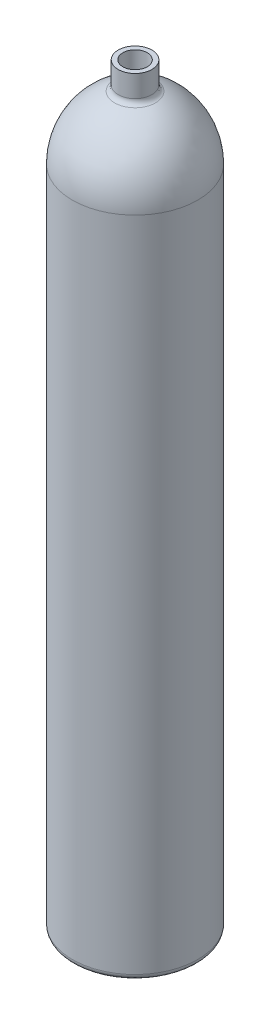
ISO-10303-21;
HEADER;
FILE_DESCRIPTION(('STEP AP214'),'2;1');
FILE_NAME('part.step','',(''),(''),'','','');
FILE_SCHEMA(('AUTOMOTIVE_DESIGN { 1 0 10303 214 1 1 1 1 }'));
ENDSEC;
DATA;
#1=APPLICATION_CONTEXT('core data for automotive mechanical design processes');
#2=APPLICATION_PROTOCOL_DEFINITION('international standard','automotive_design',2000,#1);
#3=PRODUCT_CONTEXT('',#1,'mechanical');
#4=PRODUCT('Part','Part','',(#3));
#5=PRODUCT_RELATED_PRODUCT_CATEGORY('part','',(#4));
#6=PRODUCT_DEFINITION_FORMATION('','',#4);
#7=PRODUCT_DEFINITION_CONTEXT('part definition',#1,'design');
#8=PRODUCT_DEFINITION('design','',#6,#7);
#9=PRODUCT_DEFINITION_SHAPE('','',#8);
#10=(LENGTH_UNIT() NAMED_UNIT(*) SI_UNIT(.MILLI.,.METRE.));
#11=(NAMED_UNIT(*) PLANE_ANGLE_UNIT() SI_UNIT($,.RADIAN.));
#12=(NAMED_UNIT(*) SI_UNIT($,.STERADIAN.) SOLID_ANGLE_UNIT());
#13=UNCERTAINTY_MEASURE_WITH_UNIT(LENGTH_MEASURE(1.E-05),#10,'distance_accuracy_value','');
#14=(GEOMETRIC_REPRESENTATION_CONTEXT(3) GLOBAL_UNCERTAINTY_ASSIGNED_CONTEXT((#13)) GLOBAL_UNIT_ASSIGNED_CONTEXT((#10,
#11,#12)) REPRESENTATION_CONTEXT('',''));
#15=CARTESIAN_POINT('',(0.,0.,0.));
#16=DIRECTION('',(0.,0.,1.));
#17=DIRECTION('',(1.,0.,0.));
#18=AXIS2_PLACEMENT_3D('',#15,#16,#17);
#19=CARTESIAN_POINT('',(0.,283.75,0.));
#20=DIRECTION('',(0.,-1.,0.));
#21=DIRECTION('',(0.,0.,-1.));
#22=AXIS2_PLACEMENT_3D('',#19,#20,#21);
#23=CYLINDRICAL_SURFACE('',#22,53.975);
#24=CARTESIAN_POINT('',(0.,-282.75,0.));
#25=DIRECTION('',(0.,-1.,0.));
#26=DIRECTION('',(0.,0.,-1.));
#27=AXIS2_PLACEMENT_3D('',#24,#25,#26);
#28=CIRCLE('',#27,53.975);
#29=CARTESIAN_POINT('',(0.,-282.75,-53.975));
#30=VERTEX_POINT('',#29);
#31=EDGE_CURVE('E47',#30,#30,#28,.F.);
#32=ORIENTED_EDGE('',*,*,#31,.T.);
#33=EDGE_LOOP('',(#32));
#34=FACE_BOUND('',#33,.T.);
#35=CARTESIAN_POINT('',(0.,283.75,0.));
#36=DIRECTION('',(0.,1.,0.));
#37=DIRECTION('',(0.,0.,1.));
#38=AXIS2_PLACEMENT_3D('',#35,#36,#37);
#39=CIRCLE('',#38,53.975);
#40=CARTESIAN_POINT('',(0.,283.75,53.975));
#41=VERTEX_POINT('',#40);
#42=EDGE_CURVE('E62',#41,#41,#39,.T.);
#43=ORIENTED_EDGE('',*,*,#42,.F.);
#44=EDGE_LOOP('',(#43));
#45=FACE_BOUND('',#44,.T.);
#46=ADVANCED_FACE('F36',(#34,#45),#23,.T.);
#47=CARTESIAN_POINT('',(0.,-287.75,0.));
#48=DIRECTION('',(0.,-1.,0.));
#49=DIRECTION('',(0.,0.,-1.));
#50=AXIS2_PLACEMENT_3D('',#47,#48,#49);
#51=PLANE('',#50);
#52=CARTESIAN_POINT('',(0.,-287.75,0.));
#53=DIRECTION('',(0.,-1.,0.));
#54=DIRECTION('',(0.,0.,-1.));
#55=AXIS2_PLACEMENT_3D('',#52,#53,#54);
#56=CIRCLE('',#55,48.975);
#57=CARTESIAN_POINT('',(0.,-287.75,-48.975));
#58=VERTEX_POINT('',#57);
#59=EDGE_CURVE('E51',#58,#58,#56,.T.);
#60=ORIENTED_EDGE('',*,*,#59,.T.);
#61=EDGE_LOOP('',(#60));
#62=FACE_BOUND('',#61,.T.);
#63=ADVANCED_FACE('F116',(#62),#51,.T.);
#64=CARTESIAN_POINT('',(0.,283.75,0.));
#65=DIRECTION('',(0.,-1.,0.));
#66=DIRECTION('',(0.,0.,-1.));
#67=AXIS2_PLACEMENT_3D('',#64,#65,#66);
#68=DEGENERATE_TOROIDAL_SURFACE('',#67,4.87553616323765,58.8505361632376,.F.);
#69=CARTESIAN_POINT('',(0.,338.135611119941,0.));
#70=DIRECTION('',(0.,-1.,0.));
#71=DIRECTION('',(0.,0.,-1.));
#72=AXIS2_PLACEMENT_3D('',#69,#70,#71);
#73=CIRCLE('',#72,17.6098126179385);
#74=CARTESIAN_POINT('',(0.,338.135611119941,-17.6098126179385));
#75=VERTEX_POINT('',#74);
#76=EDGE_CURVE('E43',#75,#75,#73,.T.);
#77=ORIENTED_EDGE('',*,*,#76,.T.);
#78=EDGE_LOOP('',(#77));
#79=FACE_BOUND('',#78,.T.);
#80=ORIENTED_EDGE('',*,*,#42,.T.);
#81=EDGE_LOOP('',(#80));
#82=FACE_BOUND('',#81,.T.);
#83=ADVANCED_FACE('F95',(#79,#82),#68,.F.);
#84=CARTESIAN_POINT('',(0.,283.75,0.));
#85=DIRECTION('',(0.,-1.,0.));
#86=DIRECTION('',(0.,0.,-1.));
#87=AXIS2_PLACEMENT_3D('',#84,#85,#86);
#88=DEGENERATE_TOROIDAL_SURFACE('',#87,4.87553616323765,54.8505361632376,.F.);
#89=CARTESIAN_POINT('',(0.,336.395540435104,0.));
#90=DIRECTION('',(0.,-1.,0.));
#91=DIRECTION('',(0.,0.,-1.));
#92=AXIS2_PLACEMENT_3D('',#89,#90,#91);
#93=CIRCLE('',#92,10.520190181773);
#94=CARTESIAN_POINT('',(0.,336.395540435104,-10.520190181773));
#95=VERTEX_POINT('',#94);
#96=EDGE_CURVE('E68',#95,#95,#93,.T.);
#97=ORIENTED_EDGE('',*,*,#96,.F.);
#98=EDGE_LOOP('',(#97));
#99=FACE_BOUND('',#98,.T.);
#100=CARTESIAN_POINT('',(0.,283.75,0.));
#101=DIRECTION('',(0.,-1.,0.));
#102=DIRECTION('',(0.,0.,-1.));
#103=AXIS2_PLACEMENT_3D('',#100,#101,#102);
#104=CIRCLE('',#103,49.975);
#105=CARTESIAN_POINT('',(0.,283.75,-49.975));
#106=VERTEX_POINT('',#105);
#107=EDGE_CURVE('E65',#106,#106,#104,.T.);
#108=ORIENTED_EDGE('',*,*,#107,.T.);
#109=EDGE_LOOP('',(#108));
#110=FACE_BOUND('',#109,.T.);
#111=ADVANCED_FACE('F89',(#99,#110),#88,.T.);
#112=CARTESIAN_POINT('',(0.,0.,0.));
#113=DIRECTION('',(0.,-1.,0.));
#114=DIRECTION('',(0.,0.,-1.));
#115=AXIS2_PLACEMENT_3D('',#112,#113,#114);
#116=CYLINDRICAL_SURFACE('',#115,10.520190181773);
#117=CARTESIAN_POINT('',(0.,361.5375,0.));
#118=DIRECTION('',(0.,-1.,0.));
#119=DIRECTION('',(0.,0.,-1.));
#120=AXIS2_PLACEMENT_3D('',#117,#118,#119);
#121=CIRCLE('',#120,10.520190181773);
#122=CARTESIAN_POINT('',(0.,361.5375,-10.520190181773));
#123=VERTEX_POINT('',#122);
#124=EDGE_CURVE('E71',#123,#123,#121,.T.);
#125=ORIENTED_EDGE('',*,*,#124,.F.);
#126=EDGE_LOOP('',(#125));
#127=FACE_BOUND('',#126,.T.);
#128=ORIENTED_EDGE('',*,*,#96,.T.);
#129=EDGE_LOOP('',(#128));
#130=FACE_BOUND('',#129,.T.);
#131=ADVANCED_FACE('F83',(#127,#130),#116,.F.);
#132=CARTESIAN_POINT('',(-14.520190181773,361.5375,0.));
#133=DIRECTION('',(0.,-1.,0.));
#134=DIRECTION('',(0.,0.,-1.));
#135=AXIS2_PLACEMENT_3D('',#132,#133,#134);
#136=PLANE('',#135);
#137=CARTESIAN_POINT('',(0.,361.5375,0.));
#138=DIRECTION('',(0.,-1.,0.));
#139=DIRECTION('',(0.,0.,-1.));
#140=AXIS2_PLACEMENT_3D('',#137,#138,#139);
#141=CIRCLE('',#140,14.520190181773);
#142=CARTESIAN_POINT('',(0.,361.5375,-14.520190181773));
#143=VERTEX_POINT('',#142);
#144=EDGE_CURVE('E74',#143,#143,#141,.T.);
#145=ORIENTED_EDGE('',*,*,#144,.F.);
#146=EDGE_LOOP('',(#145));
#147=FACE_BOUND('',#146,.T.);
#148=ORIENTED_EDGE('',*,*,#124,.T.);
#149=EDGE_LOOP('',(#148));
#150=FACE_BOUND('',#149,.T.);
#151=ADVANCED_FACE('F80',(#147,#150),#136,.F.);
#152=CARTESIAN_POINT('',(0.,0.,0.));
#153=DIRECTION('',(0.,-1.,0.));
#154=DIRECTION('',(0.,0.,-1.));
#155=AXIS2_PLACEMENT_3D('',#152,#153,#154);
#156=CYLINDRICAL_SURFACE('',#155,14.520190181773);
#157=CARTESIAN_POINT('',(0.,342.75626665391,0.));
#158=DIRECTION('',(0.,-1.,0.));
#159=DIRECTION('',(0.,0.,-1.));
#160=AXIS2_PLACEMENT_3D('',#157,#158,#159);
#161=CIRCLE('',#160,14.520190181773);
#162=CARTESIAN_POINT('',(0.,342.75626665391,-14.520190181773));
#163=VERTEX_POINT('',#162);
#164=EDGE_CURVE('E10',#163,#163,#161,.F.);
#165=ORIENTED_EDGE('',*,*,#164,.T.);
#166=EDGE_LOOP('',(#165));
#167=FACE_BOUND('',#166,.T.);
#168=ORIENTED_EDGE('',*,*,#144,.T.);
#169=EDGE_LOOP('',(#168));
#170=FACE_BOUND('',#169,.T.);
#171=ADVANCED_FACE('F78',(#167,#170),#156,.T.);
#172=CARTESIAN_POINT('',(0.,-283.75,0.));
#173=DIRECTION('',(0.,-1.,0.));
#174=DIRECTION('',(0.,0.,-1.));
#175=AXIS2_PLACEMENT_3D('',#172,#173,#174);
#176=PLANE('',#175);
#177=CARTESIAN_POINT('',(0.,-283.75,0.));
#178=DIRECTION('',(0.,-1.,0.));
#179=DIRECTION('',(0.,0.,-1.));
#180=AXIS2_PLACEMENT_3D('',#177,#178,#179);
#181=CIRCLE('',#180,44.975);
#182=CARTESIAN_POINT('',(0.,-283.75,-44.975));
#183=VERTEX_POINT('',#182);
#184=EDGE_CURVE('E59',#183,#183,#181,.F.);
#185=ORIENTED_EDGE('',*,*,#184,.T.);
#186=EDGE_LOOP('',(#185));
#187=FACE_BOUND('',#186,.T.);
#188=ADVANCED_FACE('F102',(#187),#176,.F.);
#189=CARTESIAN_POINT('',(0.,283.75,0.));
#190=DIRECTION('',(0.,-1.,0.));
#191=DIRECTION('',(0.,0.,-1.));
#192=AXIS2_PLACEMENT_3D('',#189,#190,#191);
#193=CYLINDRICAL_SURFACE('',#192,49.975);
#194=CARTESIAN_POINT('',(0.,-278.75,0.));
#195=DIRECTION('',(0.,-1.,0.));
#196=DIRECTION('',(0.,0.,-1.));
#197=AXIS2_PLACEMENT_3D('',#194,#195,#196);
#198=CIRCLE('',#197,49.975);
#199=CARTESIAN_POINT('',(0.,-278.75,-49.975));
#200=VERTEX_POINT('',#199);
#201=EDGE_CURVE('E56',#200,#200,#198,.T.);
#202=ORIENTED_EDGE('',*,*,#201,.T.);
#203=EDGE_LOOP('',(#202));
#204=FACE_BOUND('',#203,.T.);
#205=ORIENTED_EDGE('',*,*,#107,.F.);
#206=EDGE_LOOP('',(#205));
#207=FACE_BOUND('',#206,.T.);
#208=ADVANCED_FACE('F99',(#204,#207),#193,.F.);
#209=CARTESIAN_POINT('',(0.,-278.75,0.));
#210=DIRECTION('',(0.,-1.,0.));
#211=DIRECTION('',(0.,0.,-1.));
#212=AXIS2_PLACEMENT_3D('',#209,#210,#211);
#213=TOROIDAL_SURFACE('',#212,44.975,5.);
#214=ORIENTED_EDGE('',*,*,#201,.F.);
#215=EDGE_LOOP('',(#214));
#216=FACE_BOUND('',#215,.T.);
#217=ORIENTED_EDGE('',*,*,#184,.F.);
#218=EDGE_LOOP('',(#217));
#219=FACE_BOUND('',#218,.T.);
#220=ADVANCED_FACE('F101',(#216,#219),#213,.F.);
#221=CARTESIAN_POINT('',(0.,-282.75,0.));
#222=DIRECTION('',(0.,-1.,0.));
#223=DIRECTION('',(0.,0.,-1.));
#224=AXIS2_PLACEMENT_3D('',#221,#222,#223);
#225=TOROIDAL_SURFACE('',#224,48.975,5.);
#226=ORIENTED_EDGE('',*,*,#31,.F.);
#227=EDGE_LOOP('',(#226));
#228=FACE_BOUND('',#227,.T.);
#229=ORIENTED_EDGE('',*,*,#59,.F.);
#230=EDGE_LOOP('',(#229));
#231=FACE_BOUND('',#230,.T.);
#232=ADVANCED_FACE('F109',(#228,#231),#225,.T.);
#233=CARTESIAN_POINT('',(0.,342.75626665391,0.));
#234=DIRECTION('',(0.,-1.,0.));
#235=DIRECTION('',(0.,0.,-1.));
#236=AXIS2_PLACEMENT_3D('',#233,#234,#235);
#237=TOROIDAL_SURFACE('',#236,19.520190181773,5.);
#238=ORIENTED_EDGE('',*,*,#164,.F.);
#239=EDGE_LOOP('',(#238));
#240=FACE_BOUND('',#239,.T.);
#241=ORIENTED_EDGE('',*,*,#76,.F.);
#242=EDGE_LOOP('',(#241));
#243=FACE_BOUND('',#242,.T.);
#244=ADVANCED_FACE('F38',(#240,#243),#237,.F.);
#245=CLOSED_SHELL('',(#46,#63,#83,#111,#131,#151,#171,#188,#208,#220,#232,#244));
#246=MANIFOLD_SOLID_BREP('B2',#245);
#247=ADVANCED_BREP_SHAPE_REPRESENTATION('',(#18,#246),#14);
#248=SHAPE_DEFINITION_REPRESENTATION(#9,#247);
ENDSEC;
END-ISO-10303-21;
